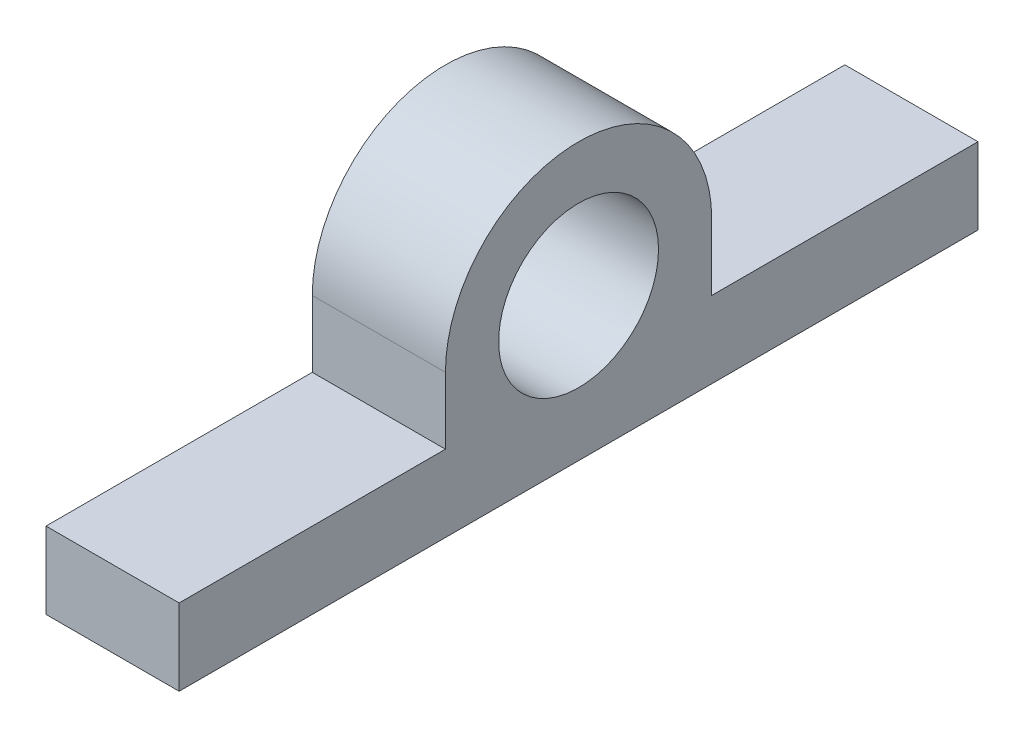
ISO-10303-21;
HEADER;
FILE_DESCRIPTION(('STEP AP214'),'2;1');
FILE_NAME('part.step','',(''),(''),'','','');
FILE_SCHEMA(('AUTOMOTIVE_DESIGN { 1 0 10303 214 1 1 1 1 }'));
ENDSEC;
DATA;
#1=APPLICATION_CONTEXT('core data for automotive mechanical design processes');
#2=APPLICATION_PROTOCOL_DEFINITION('international standard','automotive_design',2000,#1);
#3=PRODUCT_CONTEXT('',#1,'mechanical');
#4=PRODUCT('Part','Part','',(#3));
#5=PRODUCT_RELATED_PRODUCT_CATEGORY('part','',(#4));
#6=PRODUCT_DEFINITION_FORMATION('','',#4);
#7=PRODUCT_DEFINITION_CONTEXT('part definition',#1,'design');
#8=PRODUCT_DEFINITION('design','',#6,#7);
#9=PRODUCT_DEFINITION_SHAPE('','',#8);
#10=(LENGTH_UNIT() NAMED_UNIT(*) SI_UNIT(.MILLI.,.METRE.));
#11=(NAMED_UNIT(*) PLANE_ANGLE_UNIT() SI_UNIT($,.RADIAN.));
#12=(NAMED_UNIT(*) SI_UNIT($,.STERADIAN.) SOLID_ANGLE_UNIT());
#13=UNCERTAINTY_MEASURE_WITH_UNIT(LENGTH_MEASURE(1.E-05),#10,'distance_accuracy_value','');
#14=(GEOMETRIC_REPRESENTATION_CONTEXT(3) GLOBAL_UNCERTAINTY_ASSIGNED_CONTEXT((#13)) GLOBAL_UNIT_ASSIGNED_CONTEXT((#10,
#11,#12)) REPRESENTATION_CONTEXT('',''));
#15=CARTESIAN_POINT('',(0.,0.,0.));
#16=DIRECTION('',(0.,0.,1.));
#17=DIRECTION('',(1.,0.,0.));
#18=AXIS2_PLACEMENT_3D('',#15,#16,#17);
#19=CARTESIAN_POINT('',(12.7,7.3,0.));
#20=DIRECTION('',(0.,0.,-1.));
#21=DIRECTION('',(0.,1.,0.));
#22=AXIS2_PLACEMENT_3D('',#19,#20,#21);
#23=PLANE('',#22);
#24=DIRECTION('',(0.,-1.,0.));
#25=VECTOR('',#24,1.);
#26=CARTESIAN_POINT('',(0.,7.3,0.));
#27=LINE('',#26,#25);
#28=CARTESIAN_POINT('',(0.,7.3,0.));
#29=VERTEX_POINT('',#28);
#30=CARTESIAN_POINT('',(0.,0.,0.));
#31=VERTEX_POINT('',#30);
#32=EDGE_CURVE('E137',#29,#31,#27,.T.);
#33=ORIENTED_EDGE('',*,*,#32,.T.);
#34=DIRECTION('',(-1.,0.,0.));
#35=VECTOR('',#34,1.);
#36=CARTESIAN_POINT('',(12.7,0.,0.));
#37=LINE('',#36,#35);
#38=CARTESIAN_POINT('',(12.7,0.,0.));
#39=VERTEX_POINT('',#38);
#40=EDGE_CURVE('E11',#39,#31,#37,.T.);
#41=ORIENTED_EDGE('',*,*,#40,.F.);
#42=DIRECTION('',(0.,-1.,0.));
#43=VECTOR('',#42,1.);
#44=CARTESIAN_POINT('',(12.7,7.3,0.));
#45=LINE('',#44,#43);
#46=CARTESIAN_POINT('',(12.7,7.3,0.));
#47=VERTEX_POINT('',#46);
#48=EDGE_CURVE('E152',#47,#39,#45,.T.);
#49=ORIENTED_EDGE('',*,*,#48,.F.);
#50=DIRECTION('',(-1.,0.,0.));
#51=VECTOR('',#50,1.);
#52=CARTESIAN_POINT('',(12.7,7.3,0.));
#53=LINE('',#52,#51);
#54=EDGE_CURVE('E133',#47,#29,#53,.T.);
#55=ORIENTED_EDGE('',*,*,#54,.T.);
#56=EDGE_LOOP('',(#33,#41,#49,#55));
#57=FACE_BOUND('',#56,.T.);
#58=ADVANCED_FACE('F41',(#57),#23,.F.);
#59=CARTESIAN_POINT('',(12.7,0.,0.));
#60=DIRECTION('',(0.,1.,0.));
#61=DIRECTION('',(0.,0.,1.));
#62=AXIS2_PLACEMENT_3D('',#59,#60,#61);
#63=PLANE('',#62);
#64=CARTESIAN_POINT('',(6.35,0.,-12.7));
#65=DIRECTION('',(0.,-1.,0.));
#66=DIRECTION('',(0.,0.,-1.));
#67=AXIS2_PLACEMENT_3D('',#64,#65,#66);
#68=CIRCLE('',#67,2.);
#69=CARTESIAN_POINT('',(6.35,0.,-14.7));
#70=VERTEX_POINT('',#69);
#71=EDGE_CURVE('E197',#70,#70,#68,.T.);
#72=ORIENTED_EDGE('',*,*,#71,.F.);
#73=EDGE_LOOP('',(#72));
#74=FACE_BOUND('',#73,.T.);
#75=CARTESIAN_POINT('',(6.35,0.,-63.5));
#76=DIRECTION('',(0.,-1.,0.));
#77=DIRECTION('',(0.,0.,-1.));
#78=AXIS2_PLACEMENT_3D('',#75,#76,#77);
#79=CIRCLE('',#78,2.);
#80=CARTESIAN_POINT('',(6.35,0.,-65.5));
#81=VERTEX_POINT('',#80);
#82=EDGE_CURVE('E194',#81,#81,#79,.T.);
#83=ORIENTED_EDGE('',*,*,#82,.F.);
#84=EDGE_LOOP('',(#83));
#85=FACE_BOUND('',#84,.T.);
#86=DIRECTION('',(0.,0.,-1.));
#87=VECTOR('',#86,1.);
#88=CARTESIAN_POINT('',(0.,0.,0.));
#89=LINE('',#88,#87);
#90=CARTESIAN_POINT('',(0.,0.,-76.2));
#91=VERTEX_POINT('',#90);
#92=EDGE_CURVE('E140',#31,#91,#89,.T.);
#93=ORIENTED_EDGE('',*,*,#92,.T.);
#94=DIRECTION('',(-1.,0.,0.));
#95=VECTOR('',#94,1.);
#96=CARTESIAN_POINT('',(12.7,0.,-76.2));
#97=LINE('',#96,#95);
#98=CARTESIAN_POINT('',(12.7,0.,-76.2));
#99=VERTEX_POINT('',#98);
#100=EDGE_CURVE('E49',#99,#91,#97,.T.);
#101=ORIENTED_EDGE('',*,*,#100,.F.);
#102=DIRECTION('',(0.,0.,-1.));
#103=VECTOR('',#102,1.);
#104=CARTESIAN_POINT('',(12.7,0.,0.));
#105=LINE('',#104,#103);
#106=EDGE_CURVE('E100',#39,#99,#105,.T.);
#107=ORIENTED_EDGE('',*,*,#106,.F.);
#108=ORIENTED_EDGE('',*,*,#40,.T.);
#109=EDGE_LOOP('',(#93,#101,#107,#108));
#110=FACE_BOUND('',#109,.T.);
#111=ADVANCED_FACE('F212',(#74,#85,#110),#63,.F.);
#112=CARTESIAN_POINT('',(12.7,0.,-76.2));
#113=DIRECTION('',(0.,0.,1.));
#114=DIRECTION('',(1.,0.,0.));
#115=AXIS2_PLACEMENT_3D('',#112,#113,#114);
#116=PLANE('',#115);
#117=DIRECTION('',(0.,1.,0.));
#118=VECTOR('',#117,1.);
#119=CARTESIAN_POINT('',(0.,0.,-76.2));
#120=LINE('',#119,#118);
#121=CARTESIAN_POINT('',(0.,7.30000000000001,-76.2));
#122=VERTEX_POINT('',#121);
#123=EDGE_CURVE('E143',#91,#122,#120,.T.);
#124=ORIENTED_EDGE('',*,*,#123,.T.);
#125=DIRECTION('',(-1.,0.,0.));
#126=VECTOR('',#125,1.);
#127=CARTESIAN_POINT('',(12.7,7.30000000000001,-76.2));
#128=LINE('',#127,#126);
#129=CARTESIAN_POINT('',(12.7,7.30000000000001,-76.2));
#130=VERTEX_POINT('',#129);
#131=EDGE_CURVE('E159',#130,#122,#128,.T.);
#132=ORIENTED_EDGE('',*,*,#131,.F.);
#133=DIRECTION('',(0.,1.,0.));
#134=VECTOR('',#133,1.);
#135=CARTESIAN_POINT('',(12.7,0.,-76.2));
#136=LINE('',#135,#134);
#137=EDGE_CURVE('E167',#99,#130,#136,.T.);
#138=ORIENTED_EDGE('',*,*,#137,.F.);
#139=ORIENTED_EDGE('',*,*,#100,.T.);
#140=EDGE_LOOP('',(#124,#132,#138,#139));
#141=FACE_BOUND('',#140,.T.);
#142=ADVANCED_FACE('F165',(#141),#116,.F.);
#143=CARTESIAN_POINT('',(12.7,7.30000000000001,-76.2));
#144=DIRECTION('',(0.,-1.,0.));
#145=DIRECTION('',(0.,0.,-1.));
#146=AXIS2_PLACEMENT_3D('',#143,#144,#145);
#147=PLANE('',#146);
#148=DIRECTION('',(0.,0.,1.));
#149=VECTOR('',#148,1.);
#150=CARTESIAN_POINT('',(0.,7.30000000000001,-76.2));
#151=LINE('',#150,#149);
#152=CARTESIAN_POINT('',(0.,7.30000000000001,-50.8));
#153=VERTEX_POINT('',#152);
#154=EDGE_CURVE('E145',#122,#153,#151,.T.);
#155=ORIENTED_EDGE('',*,*,#154,.T.);
#156=DIRECTION('',(-1.,0.,0.));
#157=VECTOR('',#156,1.);
#158=CARTESIAN_POINT('',(12.7,7.30000000000001,-50.8));
#159=LINE('',#158,#157);
#160=CARTESIAN_POINT('',(12.7,7.30000000000001,-50.8));
#161=VERTEX_POINT('',#160);
#162=EDGE_CURVE('E156',#161,#153,#159,.T.);
#163=ORIENTED_EDGE('',*,*,#162,.F.);
#164=DIRECTION('',(0.,0.,1.));
#165=VECTOR('',#164,1.);
#166=CARTESIAN_POINT('',(12.7,7.30000000000001,-76.2));
#167=LINE('',#166,#165);
#168=EDGE_CURVE('E179',#130,#161,#167,.T.);
#169=ORIENTED_EDGE('',*,*,#168,.F.);
#170=ORIENTED_EDGE('',*,*,#131,.T.);
#171=EDGE_LOOP('',(#155,#163,#169,#170));
#172=FACE_BOUND('',#171,.T.);
#173=ADVANCED_FACE('F175',(#172),#147,.F.);
#174=CARTESIAN_POINT('',(12.7,7.30000000000001,-50.8));
#175=DIRECTION('',(0.,0.,1.));
#176=DIRECTION('',(0.,-1.,0.));
#177=AXIS2_PLACEMENT_3D('',#174,#175,#176);
#178=PLANE('',#177);
#179=DIRECTION('',(0.,1.,0.));
#180=VECTOR('',#179,1.);
#181=CARTESIAN_POINT('',(0.,7.30000000000001,-50.8));
#182=LINE('',#181,#180);
#183=CARTESIAN_POINT('',(0.,13.65,-50.8));
#184=VERTEX_POINT('',#183);
#185=EDGE_CURVE('E147',#153,#184,#182,.T.);
#186=ORIENTED_EDGE('',*,*,#185,.T.);
#187=DIRECTION('',(-1.,0.,0.));
#188=VECTOR('',#187,1.);
#189=CARTESIAN_POINT('',(12.7,13.65,-50.8));
#190=LINE('',#189,#188);
#191=CARTESIAN_POINT('',(12.7,13.65,-50.8));
#192=VERTEX_POINT('',#191);
#193=EDGE_CURVE('E128',#192,#184,#190,.T.);
#194=ORIENTED_EDGE('',*,*,#193,.F.);
#195=DIRECTION('',(0.,1.,0.));
#196=VECTOR('',#195,1.);
#197=CARTESIAN_POINT('',(12.7,7.30000000000001,-50.8));
#198=LINE('',#197,#196);
#199=EDGE_CURVE('E119',#161,#192,#198,.T.);
#200=ORIENTED_EDGE('',*,*,#199,.F.);
#201=ORIENTED_EDGE('',*,*,#162,.T.);
#202=EDGE_LOOP('',(#186,#194,#200,#201));
#203=FACE_BOUND('',#202,.T.);
#204=ADVANCED_FACE('F178',(#203),#178,.F.);
#205=CARTESIAN_POINT('',(12.7,13.65,-38.1));
#206=DIRECTION('',(-1.,0.,0.));
#207=DIRECTION('',(0.,0.,1.));
#208=AXIS2_PLACEMENT_3D('',#205,#206,#207);
#209=CYLINDRICAL_SURFACE('',#208,12.7);
#210=CARTESIAN_POINT('',(0.,13.65,-38.1));
#211=DIRECTION('',(1.,0.,0.));
#212=DIRECTION('',(0.,0.,-1.));
#213=AXIS2_PLACEMENT_3D('',#210,#211,#212);
#214=CIRCLE('',#213,12.7);
#215=CARTESIAN_POINT('',(0.,13.65,-25.4));
#216=VERTEX_POINT('',#215);
#217=EDGE_CURVE('E127',#184,#216,#214,.T.);
#218=ORIENTED_EDGE('',*,*,#217,.T.);
#219=DIRECTION('',(-1.,0.,0.));
#220=VECTOR('',#219,1.);
#221=CARTESIAN_POINT('',(12.7,13.65,-25.4));
#222=LINE('',#221,#220);
#223=CARTESIAN_POINT('',(12.7,13.65,-25.4));
#224=VERTEX_POINT('',#223);
#225=EDGE_CURVE('E124',#224,#216,#222,.T.);
#226=ORIENTED_EDGE('',*,*,#225,.F.);
#227=CARTESIAN_POINT('',(12.7,13.65,-38.1));
#228=DIRECTION('',(1.,0.,0.));
#229=DIRECTION('',(0.,0.,-1.));
#230=AXIS2_PLACEMENT_3D('',#227,#228,#229);
#231=CIRCLE('',#230,12.7);
#232=EDGE_CURVE('E113',#192,#224,#231,.T.);
#233=ORIENTED_EDGE('',*,*,#232,.F.);
#234=ORIENTED_EDGE('',*,*,#193,.T.);
#235=EDGE_LOOP('',(#218,#226,#233,#234));
#236=FACE_BOUND('',#235,.T.);
#237=ADVANCED_FACE('F125',(#236),#209,.T.);
#238=CARTESIAN_POINT('',(12.7,13.65,-25.4));
#239=DIRECTION('',(0.,0.,-1.));
#240=DIRECTION('',(-1.,0.,0.));
#241=AXIS2_PLACEMENT_3D('',#238,#239,#240);
#242=PLANE('',#241);
#243=DIRECTION('',(0.,-1.,0.));
#244=VECTOR('',#243,1.);
#245=CARTESIAN_POINT('',(0.,13.65,-25.4));
#246=LINE('',#245,#244);
#247=CARTESIAN_POINT('',(0.,7.3,-25.4));
#248=VERTEX_POINT('',#247);
#249=EDGE_CURVE('E86',#216,#248,#246,.T.);
#250=ORIENTED_EDGE('',*,*,#249,.T.);
#251=DIRECTION('',(-1.,0.,0.));
#252=VECTOR('',#251,1.);
#253=CARTESIAN_POINT('',(12.7,7.3,-25.4));
#254=LINE('',#253,#252);
#255=CARTESIAN_POINT('',(12.7,7.3,-25.4));
#256=VERTEX_POINT('',#255);
#257=EDGE_CURVE('E129',#256,#248,#254,.T.);
#258=ORIENTED_EDGE('',*,*,#257,.F.);
#259=DIRECTION('',(0.,-1.,0.));
#260=VECTOR('',#259,1.);
#261=CARTESIAN_POINT('',(12.7,13.65,-25.4));
#262=LINE('',#261,#260);
#263=EDGE_CURVE('E117',#224,#256,#262,.T.);
#264=ORIENTED_EDGE('',*,*,#263,.F.);
#265=ORIENTED_EDGE('',*,*,#225,.T.);
#266=EDGE_LOOP('',(#250,#258,#264,#265));
#267=FACE_BOUND('',#266,.T.);
#268=ADVANCED_FACE('F131',(#267),#242,.F.);
#269=CARTESIAN_POINT('',(12.7,7.3,-25.4));
#270=DIRECTION('',(0.,-1.,0.));
#271=DIRECTION('',(0.,0.,-1.));
#272=AXIS2_PLACEMENT_3D('',#269,#270,#271);
#273=PLANE('',#272);
#274=DIRECTION('',(0.,0.,1.));
#275=VECTOR('',#274,1.);
#276=CARTESIAN_POINT('',(0.,7.3,-25.4));
#277=LINE('',#276,#275);
#278=EDGE_CURVE('E92',#248,#29,#277,.T.);
#279=ORIENTED_EDGE('',*,*,#278,.T.);
#280=ORIENTED_EDGE('',*,*,#54,.F.);
#281=DIRECTION('',(0.,0.,1.));
#282=VECTOR('',#281,1.);
#283=CARTESIAN_POINT('',(12.7,7.3,-25.4));
#284=LINE('',#283,#282);
#285=EDGE_CURVE('E57',#256,#47,#284,.T.);
#286=ORIENTED_EDGE('',*,*,#285,.F.);
#287=ORIENTED_EDGE('',*,*,#257,.T.);
#288=EDGE_LOOP('',(#279,#280,#286,#287));
#289=FACE_BOUND('',#288,.T.);
#290=ADVANCED_FACE('F219',(#289),#273,.F.);
#291=CARTESIAN_POINT('',(12.7,13.65,-38.1));
#292=DIRECTION('',(1.,0.,0.));
#293=DIRECTION('',(0.,0.,-1.));
#294=AXIS2_PLACEMENT_3D('',#291,#292,#293);
#295=PLANE('',#294);
#296=CARTESIAN_POINT('',(12.7,13.65,-38.1));
#297=DIRECTION('',(1.,0.,0.));
#298=DIRECTION('',(0.,0.,-1.));
#299=AXIS2_PLACEMENT_3D('',#296,#297,#298);
#300=CIRCLE('',#299,7.62500003999999);
#301=CARTESIAN_POINT('',(12.7,13.65,-45.72500004));
#302=VERTEX_POINT('',#301);
#303=EDGE_CURVE('E185',#302,#302,#300,.T.);
#304=ORIENTED_EDGE('',*,*,#303,.F.);
#305=EDGE_LOOP('',(#304));
#306=FACE_BOUND('',#305,.T.);
#307=ORIENTED_EDGE('',*,*,#48,.T.);
#308=ORIENTED_EDGE('',*,*,#106,.T.);
#309=ORIENTED_EDGE('',*,*,#137,.T.);
#310=ORIENTED_EDGE('',*,*,#168,.T.);
#311=ORIENTED_EDGE('',*,*,#199,.T.);
#312=ORIENTED_EDGE('',*,*,#232,.T.);
#313=ORIENTED_EDGE('',*,*,#263,.T.);
#314=ORIENTED_EDGE('',*,*,#285,.T.);
#315=EDGE_LOOP('',(#307,#308,#309,#310,#311,#312,#313,#314));
#316=FACE_BOUND('',#315,.T.);
#317=ADVANCED_FACE('F115',(#306,#316),#295,.T.);
#318=CARTESIAN_POINT('',(0.,13.65,-38.1));
#319=DIRECTION('',(1.,0.,0.));
#320=DIRECTION('',(0.,0.,-1.));
#321=AXIS2_PLACEMENT_3D('',#318,#319,#320);
#322=PLANE('',#321);
#323=CARTESIAN_POINT('',(0.,13.65,-38.1));
#324=DIRECTION('',(1.,0.,0.));
#325=DIRECTION('',(0.,0.,-1.));
#326=AXIS2_PLACEMENT_3D('',#323,#324,#325);
#327=CIRCLE('',#326,7.62500003999999);
#328=CARTESIAN_POINT('',(0.,13.65,-45.72500004));
#329=VERTEX_POINT('',#328);
#330=EDGE_CURVE('E141',#329,#329,#327,.T.);
#331=ORIENTED_EDGE('',*,*,#330,.T.);
#332=EDGE_LOOP('',(#331));
#333=FACE_BOUND('',#332,.T.);
#334=ORIENTED_EDGE('',*,*,#32,.F.);
#335=ORIENTED_EDGE('',*,*,#278,.F.);
#336=ORIENTED_EDGE('',*,*,#249,.F.);
#337=ORIENTED_EDGE('',*,*,#217,.F.);
#338=ORIENTED_EDGE('',*,*,#185,.F.);
#339=ORIENTED_EDGE('',*,*,#154,.F.);
#340=ORIENTED_EDGE('',*,*,#123,.F.);
#341=ORIENTED_EDGE('',*,*,#92,.F.);
#342=EDGE_LOOP('',(#334,#335,#336,#337,#338,#339,#340,#341));
#343=FACE_BOUND('',#342,.T.);
#344=ADVANCED_FACE('F171',(#333,#343),#322,.F.);
#345=CARTESIAN_POINT('',(0.,13.65,-38.1));
#346=DIRECTION('',(1.,0.,0.));
#347=DIRECTION('',(0.,0.,-1.));
#348=AXIS2_PLACEMENT_3D('',#345,#346,#347);
#349=CYLINDRICAL_SURFACE('',#348,7.62500003999999);
#350=ORIENTED_EDGE('',*,*,#330,.F.);
#351=EDGE_LOOP('',(#350));
#352=FACE_BOUND('',#351,.T.);
#353=ORIENTED_EDGE('',*,*,#303,.T.);
#354=EDGE_LOOP('',(#353));
#355=FACE_BOUND('',#354,.T.);
#356=ADVANCED_FACE('F287',(#352,#355),#349,.F.);
#357=CARTESIAN_POINT('',(6.35,7.,-63.5));
#358=DIRECTION('',(0.,-1.,0.));
#359=DIRECTION('',(0.,0.,-1.));
#360=AXIS2_PLACEMENT_3D('',#357,#358,#359);
#361=CYLINDRICAL_SURFACE('',#360,2.);
#362=CARTESIAN_POINT('',(6.35,7.,-63.5));
#363=DIRECTION('',(0.,-1.,0.));
#364=DIRECTION('',(0.,0.,-1.));
#365=AXIS2_PLACEMENT_3D('',#362,#363,#364);
#366=CIRCLE('',#365,2.);
#367=CARTESIAN_POINT('',(6.35,7.,-65.5));
#368=VERTEX_POINT('',#367);
#369=EDGE_CURVE('E191',#368,#368,#366,.T.);
#370=ORIENTED_EDGE('',*,*,#369,.F.);
#371=EDGE_LOOP('',(#370));
#372=FACE_BOUND('',#371,.T.);
#373=ORIENTED_EDGE('',*,*,#82,.T.);
#374=EDGE_LOOP('',(#373));
#375=FACE_BOUND('',#374,.T.);
#376=ADVANCED_FACE('F296',(#372,#375),#361,.F.);
#377=CARTESIAN_POINT('',(6.35,7.,-63.5));
#378=DIRECTION('',(0.,-1.,0.));
#379=DIRECTION('',(0.,0.,-1.));
#380=AXIS2_PLACEMENT_3D('',#377,#378,#379);
#381=PLANE('',#380);
#382=ORIENTED_EDGE('',*,*,#369,.T.);
#383=EDGE_LOOP('',(#382));
#384=FACE_BOUND('',#383,.T.);
#385=ADVANCED_FACE('F208',(#384),#381,.T.);
#386=CARTESIAN_POINT('',(6.35,7.,-12.7));
#387=DIRECTION('',(0.,-1.,0.));
#388=DIRECTION('',(0.,0.,-1.));
#389=AXIS2_PLACEMENT_3D('',#386,#387,#388);
#390=CYLINDRICAL_SURFACE('',#389,2.);
#391=CARTESIAN_POINT('',(6.35,7.,-12.7));
#392=DIRECTION('',(0.,-1.,0.));
#393=DIRECTION('',(0.,0.,-1.));
#394=AXIS2_PLACEMENT_3D('',#391,#392,#393);
#395=CIRCLE('',#394,2.);
#396=CARTESIAN_POINT('',(6.35,7.,-14.7));
#397=VERTEX_POINT('',#396);
#398=EDGE_CURVE('E188',#397,#397,#395,.T.);
#399=ORIENTED_EDGE('',*,*,#398,.F.);
#400=EDGE_LOOP('',(#399));
#401=FACE_BOUND('',#400,.T.);
#402=ORIENTED_EDGE('',*,*,#71,.T.);
#403=EDGE_LOOP('',(#402));
#404=FACE_BOUND('',#403,.T.);
#405=ADVANCED_FACE('F205',(#401,#404),#390,.F.);
#406=CARTESIAN_POINT('',(6.35,7.,-12.7));
#407=DIRECTION('',(0.,-1.,0.));
#408=DIRECTION('',(0.,0.,-1.));
#409=AXIS2_PLACEMENT_3D('',#406,#407,#408);
#410=PLANE('',#409);
#411=ORIENTED_EDGE('',*,*,#398,.T.);
#412=EDGE_LOOP('',(#411));
#413=FACE_BOUND('',#412,.T.);
#414=ADVANCED_FACE('F203',(#413),#410,.T.);
#415=CLOSED_SHELL('',(#58,#111,#142,#173,#204,#237,#268,#290,#317,#344,#356,#376,#385,#405,#414));
#416=MANIFOLD_SOLID_BREP('B2',#415);
#417=ADVANCED_BREP_SHAPE_REPRESENTATION('',(#18,#416),#14);
#418=SHAPE_DEFINITION_REPRESENTATION(#9,#417);
ENDSEC;
END-ISO-10303-21;
